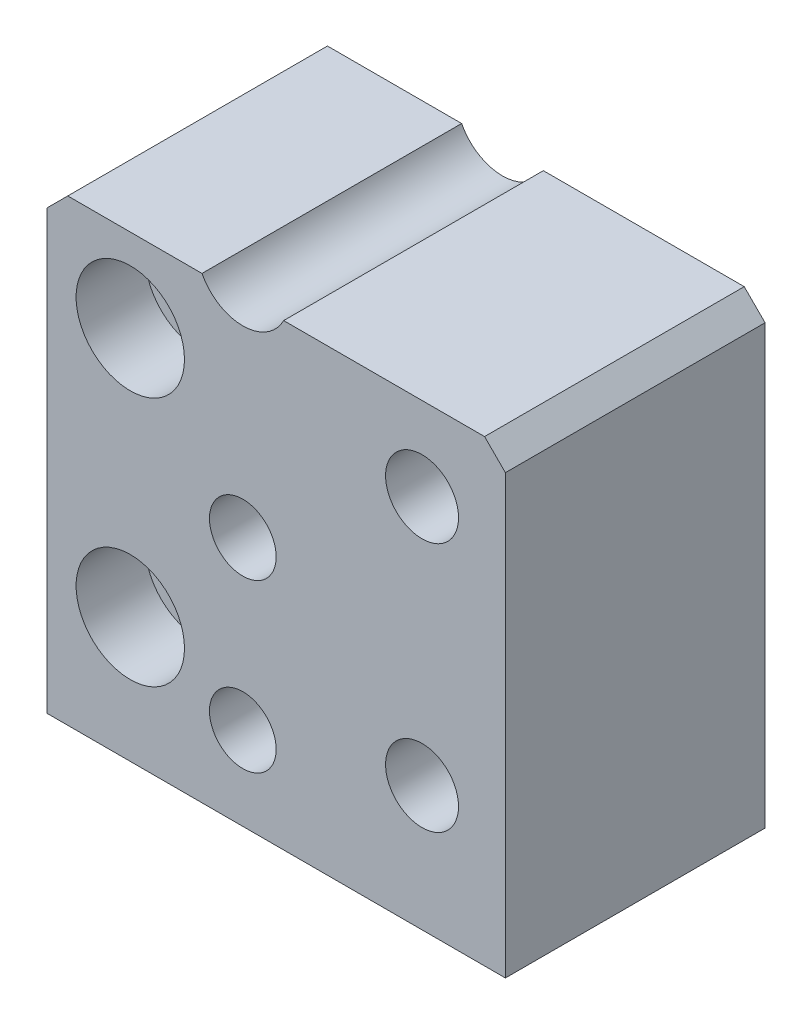
ISO-10303-21;
HEADER;
FILE_DESCRIPTION(('STEP AP214'),'2;1');
FILE_NAME('part.step','',(''),(''),'','','');
FILE_SCHEMA(('AUTOMOTIVE_DESIGN { 1 0 10303 214 1 1 1 1 }'));
ENDSEC;
DATA;
#1=APPLICATION_CONTEXT('core data for automotive mechanical design processes');
#2=APPLICATION_PROTOCOL_DEFINITION('international standard','automotive_design',2000,#1);
#3=PRODUCT_CONTEXT('',#1,'mechanical');
#4=PRODUCT('Part','Part','',(#3));
#5=PRODUCT_RELATED_PRODUCT_CATEGORY('part','',(#4));
#6=PRODUCT_DEFINITION_FORMATION('','',#4);
#7=PRODUCT_DEFINITION_CONTEXT('part definition',#1,'design');
#8=PRODUCT_DEFINITION('design','',#6,#7);
#9=PRODUCT_DEFINITION_SHAPE('','',#8);
#10=(LENGTH_UNIT() NAMED_UNIT(*) SI_UNIT(.MILLI.,.METRE.));
#11=(NAMED_UNIT(*) PLANE_ANGLE_UNIT() SI_UNIT($,.RADIAN.));
#12=(NAMED_UNIT(*) SI_UNIT($,.STERADIAN.) SOLID_ANGLE_UNIT());
#13=UNCERTAINTY_MEASURE_WITH_UNIT(LENGTH_MEASURE(1.E-05),#10,'distance_accuracy_value','');
#14=(GEOMETRIC_REPRESENTATION_CONTEXT(3) GLOBAL_UNCERTAINTY_ASSIGNED_CONTEXT((#13)) GLOBAL_UNIT_ASSIGNED_CONTEXT((#10,
#11,#12)) REPRESENTATION_CONTEXT('',''));
#15=CARTESIAN_POINT('',(0.,0.,0.));
#16=DIRECTION('',(0.,0.,1.));
#17=DIRECTION('',(1.,0.,0.));
#18=AXIS2_PLACEMENT_3D('',#15,#16,#17);
#19=CARTESIAN_POINT('',(0.,110.,0.));
#20=DIRECTION('',(0.,1.,0.));
#21=DIRECTION('',(0.,0.,1.));
#22=AXIS2_PLACEMENT_3D('',#19,#20,#21);
#23=PLANE('',#22);
#24=DIRECTION('',(1.,0.,0.));
#25=VECTOR('',#24,1.);
#26=CARTESIAN_POINT('',(-55.,110.,31.15));
#27=LINE('',#26,#25);
#28=CARTESIAN_POINT('',(1.79795897113267,110.,31.15));
#29=VERTEX_POINT('',#28);
#30=CARTESIAN_POINT('',(50.,110.,31.15));
#31=VERTEX_POINT('',#30);
#32=EDGE_CURVE('E387',#29,#31,#27,.T.);
#33=ORIENTED_EDGE('',*,*,#32,.T.);
#34=DIRECTION('',(0.,0.,-1.));
#35=VECTOR('',#34,1.);
#36=CARTESIAN_POINT('',(50.,110.,-31.15));
#37=LINE('',#36,#35);
#38=CARTESIAN_POINT('',(50.,110.,-31.15));
#39=VERTEX_POINT('',#38);
#40=EDGE_CURVE('E315',#31,#39,#37,.T.);
#41=ORIENTED_EDGE('',*,*,#40,.T.);
#42=DIRECTION('',(-1.,0.,0.));
#43=VECTOR('',#42,1.);
#44=CARTESIAN_POINT('',(-55.,110.,-31.15));
#45=LINE('',#44,#43);
#46=CARTESIAN_POINT('',(1.79795897113267,110.,-31.15));
#47=VERTEX_POINT('',#46);
#48=EDGE_CURVE('E388',#39,#47,#45,.T.);
#49=ORIENTED_EDGE('',*,*,#48,.T.);
#50=DIRECTION('',(0.,0.,-1.));
#51=VECTOR('',#50,1.);
#52=CARTESIAN_POINT('',(1.79795897113267,110.,-31.15));
#53=LINE('',#52,#51);
#54=EDGE_CURVE('E375',#29,#47,#53,.T.);
#55=ORIENTED_EDGE('',*,*,#54,.F.);
#56=EDGE_LOOP('',(#33,#41,#49,#55));
#57=FACE_BOUND('',#56,.T.);
#58=ADVANCED_FACE('F307',(#57),#23,.T.);
#59=CARTESIAN_POINT('',(55.,110.,-31.15));
#60=DIRECTION('',(-1.,0.,0.));
#61=DIRECTION('',(0.,0.,1.));
#62=AXIS2_PLACEMENT_3D('',#59,#60,#61);
#63=PLANE('',#62);
#64=DIRECTION('',(0.,-1.,0.));
#65=VECTOR('',#64,1.);
#66=CARTESIAN_POINT('',(55.,110.,-31.15));
#67=LINE('',#66,#65);
#68=CARTESIAN_POINT('',(55.,105.,-31.15));
#69=VERTEX_POINT('',#68);
#70=CARTESIAN_POINT('',(55.,0.,-31.15));
#71=VERTEX_POINT('',#70);
#72=EDGE_CURVE('E420',#69,#71,#67,.T.);
#73=ORIENTED_EDGE('',*,*,#72,.F.);
#74=DIRECTION('',(0.,0.,1.));
#75=VECTOR('',#74,1.);
#76=CARTESIAN_POINT('',(55.,105.,31.15));
#77=LINE('',#76,#75);
#78=CARTESIAN_POINT('',(55.,105.,31.15));
#79=VERTEX_POINT('',#78);
#80=EDGE_CURVE('E14',#69,#79,#77,.T.);
#81=ORIENTED_EDGE('',*,*,#80,.T.);
#82=DIRECTION('',(0.,-1.,0.));
#83=VECTOR('',#82,1.);
#84=CARTESIAN_POINT('',(55.,110.,31.15));
#85=LINE('',#84,#83);
#86=CARTESIAN_POINT('',(55.,0.,31.15));
#87=VERTEX_POINT('',#86);
#88=EDGE_CURVE('E397',#79,#87,#85,.T.);
#89=ORIENTED_EDGE('',*,*,#88,.T.);
#90=DIRECTION('',(0.,0.,-1.));
#91=VECTOR('',#90,1.);
#92=CARTESIAN_POINT('',(55.,0.,-31.15));
#93=LINE('',#92,#91);
#94=EDGE_CURVE('E402',#87,#71,#93,.T.);
#95=ORIENTED_EDGE('',*,*,#94,.T.);
#96=EDGE_LOOP('',(#73,#81,#89,#95));
#97=FACE_BOUND('',#96,.T.);
#98=ADVANCED_FACE('F508',(#97),#63,.F.);
#99=CARTESIAN_POINT('',(-55.,110.,-31.15));
#100=DIRECTION('',(0.,0.,1.));
#101=DIRECTION('',(1.,0.,0.));
#102=AXIS2_PLACEMENT_3D('',#99,#100,#101);
#103=PLANE('',#102);
#104=CARTESIAN_POINT('',(-35.,90.,-31.15));
#105=DIRECTION('',(0.,0.,-1.));
#106=DIRECTION('',(-1.,0.,0.));
#107=AXIS2_PLACEMENT_3D('',#104,#105,#106);
#108=CIRCLE('',#107,13.);
#109=CARTESIAN_POINT('',(-48.,90.,-31.15));
#110=VERTEX_POINT('',#109);
#111=EDGE_CURVE('E545',#110,#110,#108,.T.);
#112=ORIENTED_EDGE('',*,*,#111,.F.);
#113=EDGE_LOOP('',(#112));
#114=FACE_BOUND('',#113,.T.);
#115=CARTESIAN_POINT('',(-35.,30.,-31.15));
#116=DIRECTION('',(0.,0.,-1.));
#117=DIRECTION('',(-1.,0.,0.));
#118=AXIS2_PLACEMENT_3D('',#115,#116,#117);
#119=CIRCLE('',#118,13.);
#120=CARTESIAN_POINT('',(-48.,30.,-31.15));
#121=VERTEX_POINT('',#120);
#122=EDGE_CURVE('E549',#121,#121,#119,.T.);
#123=ORIENTED_EDGE('',*,*,#122,.F.);
#124=EDGE_LOOP('',(#123));
#125=FACE_BOUND('',#124,.T.);
#126=CARTESIAN_POINT('',(-8.00000000000002,60.,-31.15));
#127=DIRECTION('',(0.,0.,-1.));
#128=DIRECTION('',(-1.,0.,0.));
#129=AXIS2_PLACEMENT_3D('',#126,#127,#128);
#130=CIRCLE('',#129,7.99999999999999);
#131=CARTESIAN_POINT('',(-16.,60.,-31.15));
#132=VERTEX_POINT('',#131);
#133=EDGE_CURVE('E382',#132,#132,#130,.T.);
#134=ORIENTED_EDGE('',*,*,#133,.F.);
#135=EDGE_LOOP('',(#134));
#136=FACE_BOUND('',#135,.T.);
#137=CARTESIAN_POINT('',(-8.00000000000002,20.,-31.15));
#138=DIRECTION('',(0.,0.,-1.));
#139=DIRECTION('',(-1.,0.,0.));
#140=AXIS2_PLACEMENT_3D('',#137,#138,#139);
#141=CIRCLE('',#140,7.99999999999999);
#142=CARTESIAN_POINT('',(-16.,20.,-31.15));
#143=VERTEX_POINT('',#142);
#144=EDGE_CURVE('E448',#143,#143,#141,.T.);
#145=ORIENTED_EDGE('',*,*,#144,.F.);
#146=EDGE_LOOP('',(#145));
#147=FACE_BOUND('',#146,.T.);
#148=CARTESIAN_POINT('',(35.,90.,-31.15));
#149=DIRECTION('',(0.,0.,1.));
#150=DIRECTION('',(1.,0.,0.));
#151=AXIS2_PLACEMENT_3D('',#148,#149,#150);
#152=CIRCLE('',#151,8.74999999999999);
#153=CARTESIAN_POINT('',(43.75,90.,-31.15));
#154=VERTEX_POINT('',#153);
#155=EDGE_CURVE('E475',#154,#154,#152,.T.);
#156=ORIENTED_EDGE('',*,*,#155,.T.);
#157=EDGE_LOOP('',(#156));
#158=FACE_BOUND('',#157,.T.);
#159=CARTESIAN_POINT('',(35.,30.,-31.15));
#160=DIRECTION('',(0.,0.,1.));
#161=DIRECTION('',(1.,0.,0.));
#162=AXIS2_PLACEMENT_3D('',#159,#160,#161);
#163=CIRCLE('',#162,8.74999999999999);
#164=CARTESIAN_POINT('',(43.75,30.,-31.15));
#165=VERTEX_POINT('',#164);
#166=EDGE_CURVE('E406',#165,#165,#163,.T.);
#167=ORIENTED_EDGE('',*,*,#166,.T.);
#168=EDGE_LOOP('',(#167));
#169=FACE_BOUND('',#168,.T.);
#170=DIRECTION('',(0.,-1.,0.));
#171=VECTOR('',#170,1.);
#172=CARTESIAN_POINT('',(-55.,110.,-31.15));
#173=LINE('',#172,#171);
#174=CARTESIAN_POINT('',(-55.,105.,-31.15));
#175=VERTEX_POINT('',#174);
#176=CARTESIAN_POINT('',(-55.,0.,-31.15));
#177=VERTEX_POINT('',#176);
#178=EDGE_CURVE('E418',#175,#177,#173,.T.);
#179=ORIENTED_EDGE('',*,*,#178,.F.);
#180=DIRECTION('',(0.707106781186547,0.707106781186549,0.));
#181=VECTOR('',#180,1.);
#182=CARTESIAN_POINT('',(-50.,110.,-31.15));
#183=LINE('',#182,#181);
#184=CARTESIAN_POINT('',(-50.,110.,-31.15));
#185=VERTEX_POINT('',#184);
#186=EDGE_CURVE('E431',#175,#185,#183,.T.);
#187=ORIENTED_EDGE('',*,*,#186,.T.);
#188=CARTESIAN_POINT('',(-17.7979589711327,110.,-31.15));
#189=VERTEX_POINT('',#188);
#190=EDGE_CURVE('E398',#189,#185,#45,.T.);
#191=ORIENTED_EDGE('',*,*,#190,.F.);
#192=CARTESIAN_POINT('',(-8.00000000000003,115.,-31.15));
#193=DIRECTION('',(0.,0.,-1.));
#194=DIRECTION('',(-1.,0.,0.));
#195=AXIS2_PLACEMENT_3D('',#192,#193,#194);
#196=CIRCLE('',#195,11.);
#197=EDGE_CURVE('E383',#47,#189,#196,.T.);
#198=ORIENTED_EDGE('',*,*,#197,.F.);
#199=ORIENTED_EDGE('',*,*,#48,.F.);
#200=DIRECTION('',(0.707106781186546,-0.707106781186549,0.));
#201=VECTOR('',#200,1.);
#202=CARTESIAN_POINT('',(50.,110.,-31.15));
#203=LINE('',#202,#201);
#204=EDGE_CURVE('E322',#39,#69,#203,.T.);
#205=ORIENTED_EDGE('',*,*,#204,.T.);
#206=ORIENTED_EDGE('',*,*,#72,.T.);
#207=DIRECTION('',(-1.,0.,0.));
#208=VECTOR('',#207,1.);
#209=CARTESIAN_POINT('',(-55.,0.,-31.15));
#210=LINE('',#209,#208);
#211=EDGE_CURVE('E405',#71,#177,#210,.T.);
#212=ORIENTED_EDGE('',*,*,#211,.T.);
#213=EDGE_LOOP('',(#179,#187,#191,#198,#199,#205,#206,#212));
#214=FACE_BOUND('',#213,.T.);
#215=ADVANCED_FACE('F433',(#114,#125,#136,#147,#158,#169,#214),#103,.F.);
#216=CARTESIAN_POINT('',(-55.,110.,-31.15));
#217=DIRECTION('',(1.,0.,0.));
#218=DIRECTION('',(0.,0.,-1.));
#219=AXIS2_PLACEMENT_3D('',#216,#217,#218);
#220=PLANE('',#219);
#221=DIRECTION('',(0.,-1.,0.));
#222=VECTOR('',#221,1.);
#223=CARTESIAN_POINT('',(-55.,110.,31.15));
#224=LINE('',#223,#222);
#225=CARTESIAN_POINT('',(-55.,105.,31.15));
#226=VERTEX_POINT('',#225);
#227=CARTESIAN_POINT('',(-55.,0.,31.15));
#228=VERTEX_POINT('',#227);
#229=EDGE_CURVE('E416',#226,#228,#224,.T.);
#230=ORIENTED_EDGE('',*,*,#229,.F.);
#231=DIRECTION('',(0.,0.,-1.));
#232=VECTOR('',#231,1.);
#233=CARTESIAN_POINT('',(-55.,105.,-31.15));
#234=LINE('',#233,#232);
#235=EDGE_CURVE('E428',#226,#175,#234,.T.);
#236=ORIENTED_EDGE('',*,*,#235,.T.);
#237=ORIENTED_EDGE('',*,*,#178,.T.);
#238=DIRECTION('',(0.,0.,1.));
#239=VECTOR('',#238,1.);
#240=CARTESIAN_POINT('',(-55.,0.,-31.15));
#241=LINE('',#240,#239);
#242=EDGE_CURVE('E409',#177,#228,#241,.T.);
#243=ORIENTED_EDGE('',*,*,#242,.T.);
#244=EDGE_LOOP('',(#230,#236,#237,#243));
#245=FACE_BOUND('',#244,.T.);
#246=ADVANCED_FACE('F494',(#245),#220,.F.);
#247=CARTESIAN_POINT('',(-55.,110.,31.15));
#248=DIRECTION('',(0.,0.,-1.));
#249=DIRECTION('',(-1.,0.,0.));
#250=AXIS2_PLACEMENT_3D('',#247,#248,#249);
#251=PLANE('',#250);
#252=CARTESIAN_POINT('',(-8.00000000000002,60.,31.15));
#253=DIRECTION('',(0.,0.,-1.));
#254=DIRECTION('',(-1.,0.,0.));
#255=AXIS2_PLACEMENT_3D('',#252,#253,#254);
#256=CIRCLE('',#255,7.99999999999999);
#257=CARTESIAN_POINT('',(-16.,60.,31.15));
#258=VERTEX_POINT('',#257);
#259=EDGE_CURVE('E445',#258,#258,#256,.T.);
#260=ORIENTED_EDGE('',*,*,#259,.T.);
#261=EDGE_LOOP('',(#260));
#262=FACE_BOUND('',#261,.T.);
#263=CARTESIAN_POINT('',(-8.00000000000002,20.,31.15));
#264=DIRECTION('',(0.,0.,-1.));
#265=DIRECTION('',(-1.,0.,0.));
#266=AXIS2_PLACEMENT_3D('',#263,#264,#265);
#267=CIRCLE('',#266,7.99999999999999);
#268=CARTESIAN_POINT('',(-16.,20.,31.15));
#269=VERTEX_POINT('',#268);
#270=EDGE_CURVE('E451',#269,#269,#267,.T.);
#271=ORIENTED_EDGE('',*,*,#270,.T.);
#272=EDGE_LOOP('',(#271));
#273=FACE_BOUND('',#272,.T.);
#274=CARTESIAN_POINT('',(-35.,90.,31.15));
#275=DIRECTION('',(0.,0.,1.));
#276=DIRECTION('',(1.,0.,0.));
#277=AXIS2_PLACEMENT_3D('',#274,#275,#276);
#278=CIRCLE('',#277,13.);
#279=CARTESIAN_POINT('',(-22.,90.,31.15));
#280=VERTEX_POINT('',#279);
#281=EDGE_CURVE('E454',#280,#280,#278,.T.);
#282=ORIENTED_EDGE('',*,*,#281,.F.);
#283=EDGE_LOOP('',(#282));
#284=FACE_BOUND('',#283,.T.);
#285=CARTESIAN_POINT('',(-35.,30.,31.15));
#286=DIRECTION('',(0.,0.,1.));
#287=DIRECTION('',(1.,0.,0.));
#288=AXIS2_PLACEMENT_3D('',#285,#286,#287);
#289=CIRCLE('',#288,13.);
#290=CARTESIAN_POINT('',(-22.,30.,31.15));
#291=VERTEX_POINT('',#290);
#292=EDGE_CURVE('E463',#291,#291,#289,.T.);
#293=ORIENTED_EDGE('',*,*,#292,.F.);
#294=EDGE_LOOP('',(#293));
#295=FACE_BOUND('',#294,.T.);
#296=CARTESIAN_POINT('',(35.,90.,31.15));
#297=DIRECTION('',(0.,0.,1.));
#298=DIRECTION('',(1.,0.,0.));
#299=AXIS2_PLACEMENT_3D('',#296,#297,#298);
#300=CIRCLE('',#299,8.74999999999999);
#301=CARTESIAN_POINT('',(43.75,90.,31.15));
#302=VERTEX_POINT('',#301);
#303=EDGE_CURVE('E472',#302,#302,#300,.T.);
#304=ORIENTED_EDGE('',*,*,#303,.F.);
#305=EDGE_LOOP('',(#304));
#306=FACE_BOUND('',#305,.T.);
#307=CARTESIAN_POINT('',(35.,30.,31.15));
#308=DIRECTION('',(0.,0.,1.));
#309=DIRECTION('',(1.,0.,0.));
#310=AXIS2_PLACEMENT_3D('',#307,#308,#309);
#311=CIRCLE('',#310,8.74999999999999);
#312=CARTESIAN_POINT('',(43.75,30.,31.15));
#313=VERTEX_POINT('',#312);
#314=EDGE_CURVE('E478',#313,#313,#311,.T.);
#315=ORIENTED_EDGE('',*,*,#314,.F.);
#316=EDGE_LOOP('',(#315));
#317=FACE_BOUND('',#316,.T.);
#318=CARTESIAN_POINT('',(-50.,110.,31.15));
#319=VERTEX_POINT('',#318);
#320=CARTESIAN_POINT('',(-17.7979589711327,110.,31.15));
#321=VERTEX_POINT('',#320);
#322=EDGE_CURVE('E395',#319,#321,#27,.T.);
#323=ORIENTED_EDGE('',*,*,#322,.F.);
#324=DIRECTION('',(-0.707106781186547,-0.707106781186549,0.));
#325=VECTOR('',#324,1.);
#326=CARTESIAN_POINT('',(-50.,110.,31.15));
#327=LINE('',#326,#325);
#328=EDGE_CURVE('E426',#319,#226,#327,.T.);
#329=ORIENTED_EDGE('',*,*,#328,.T.);
#330=ORIENTED_EDGE('',*,*,#229,.T.);
#331=DIRECTION('',(1.,0.,0.));
#332=VECTOR('',#331,1.);
#333=CARTESIAN_POINT('',(-55.,0.,31.15));
#334=LINE('',#333,#332);
#335=EDGE_CURVE('E412',#228,#87,#334,.T.);
#336=ORIENTED_EDGE('',*,*,#335,.T.);
#337=ORIENTED_EDGE('',*,*,#88,.F.);
#338=DIRECTION('',(-0.707106781186546,0.707106781186549,0.));
#339=VECTOR('',#338,1.);
#340=CARTESIAN_POINT('',(50.,110.,31.15));
#341=LINE('',#340,#339);
#342=EDGE_CURVE('E394',#79,#31,#341,.T.);
#343=ORIENTED_EDGE('',*,*,#342,.T.);
#344=ORIENTED_EDGE('',*,*,#32,.F.);
#345=CARTESIAN_POINT('',(-8.00000000000003,115.,31.15));
#346=DIRECTION('',(0.,0.,-1.));
#347=DIRECTION('',(-1.,0.,0.));
#348=AXIS2_PLACEMENT_3D('',#345,#346,#347);
#349=CIRCLE('',#348,11.);
#350=EDGE_CURVE('E372',#29,#321,#349,.T.);
#351=ORIENTED_EDGE('',*,*,#350,.T.);
#352=EDGE_LOOP('',(#323,#329,#330,#336,#337,#343,#344,#351));
#353=FACE_BOUND('',#352,.T.);
#354=ADVANCED_FACE('F391',(#262,#273,#284,#295,#306,#317,#353),#251,.F.);
#355=ORIENTED_EDGE('',*,*,#190,.T.);
#356=DIRECTION('',(0.,0.,1.));
#357=VECTOR('',#356,1.);
#358=CARTESIAN_POINT('',(-50.,110.,31.15));
#359=LINE('',#358,#357);
#360=EDGE_CURVE('E389',#185,#319,#359,.T.);
#361=ORIENTED_EDGE('',*,*,#360,.T.);
#362=ORIENTED_EDGE('',*,*,#322,.T.);
#363=DIRECTION('',(0.,0.,-1.));
#364=VECTOR('',#363,1.);
#365=CARTESIAN_POINT('',(-17.7979589711327,110.,-31.15));
#366=LINE('',#365,#364);
#367=EDGE_CURVE('E378',#189,#321,#366,.F.);
#368=ORIENTED_EDGE('',*,*,#367,.F.);
#369=EDGE_LOOP('',(#355,#361,#362,#368));
#370=FACE_BOUND('',#369,.T.);
#371=ADVANCED_FACE('F493',(#370),#23,.T.);
#372=CARTESIAN_POINT('',(0.,0.,0.));
#373=DIRECTION('',(0.,1.,0.));
#374=DIRECTION('',(0.,0.,1.));
#375=AXIS2_PLACEMENT_3D('',#372,#373,#374);
#376=PLANE('',#375);
#377=ORIENTED_EDGE('',*,*,#94,.F.);
#378=ORIENTED_EDGE('',*,*,#335,.F.);
#379=ORIENTED_EDGE('',*,*,#242,.F.);
#380=ORIENTED_EDGE('',*,*,#211,.F.);
#381=EDGE_LOOP('',(#377,#378,#379,#380));
#382=FACE_BOUND('',#381,.T.);
#383=ADVANCED_FACE('F488',(#382),#376,.F.);
#384=CARTESIAN_POINT('',(35.,30.,31.15));
#385=DIRECTION('',(0.,0.,1.));
#386=DIRECTION('',(1.,0.,0.));
#387=AXIS2_PLACEMENT_3D('',#384,#385,#386);
#388=CYLINDRICAL_SURFACE('',#387,8.74999999999999);
#389=ORIENTED_EDGE('',*,*,#166,.F.);
#390=EDGE_LOOP('',(#389));
#391=FACE_BOUND('',#390,.T.);
#392=ORIENTED_EDGE('',*,*,#314,.T.);
#393=EDGE_LOOP('',(#392));
#394=FACE_BOUND('',#393,.T.);
#395=ADVANCED_FACE('F484',(#391,#394),#388,.F.);
#396=CARTESIAN_POINT('',(35.,90.,31.15));
#397=DIRECTION('',(0.,0.,1.));
#398=DIRECTION('',(1.,0.,0.));
#399=AXIS2_PLACEMENT_3D('',#396,#397,#398);
#400=CYLINDRICAL_SURFACE('',#399,8.74999999999999);
#401=ORIENTED_EDGE('',*,*,#155,.F.);
#402=EDGE_LOOP('',(#401));
#403=FACE_BOUND('',#402,.T.);
#404=ORIENTED_EDGE('',*,*,#303,.T.);
#405=EDGE_LOOP('',(#404));
#406=FACE_BOUND('',#405,.T.);
#407=ADVANCED_FACE('F487',(#403,#406),#400,.F.);
#408=CARTESIAN_POINT('',(-35.,30.,31.15));
#409=DIRECTION('',(0.,0.,1.));
#410=DIRECTION('',(1.,0.,0.));
#411=AXIS2_PLACEMENT_3D('',#408,#409,#410);
#412=CYLINDRICAL_SURFACE('',#411,8.74999999999999);
#413=CARTESIAN_POINT('',(-35.,30.,-14.55));
#414=DIRECTION('',(0.,0.,-1.));
#415=DIRECTION('',(-1.,0.,0.));
#416=AXIS2_PLACEMENT_3D('',#413,#414,#415);
#417=CIRCLE('',#416,8.75000000000001);
#418=CARTESIAN_POINT('',(-43.75,30.,-14.55));
#419=VERTEX_POINT('',#418);
#420=EDGE_CURVE('E436',#419,#419,#417,.T.);
#421=ORIENTED_EDGE('',*,*,#420,.T.);
#422=EDGE_LOOP('',(#421));
#423=FACE_BOUND('',#422,.T.);
#424=CARTESIAN_POINT('',(-35.,30.,14.55));
#425=DIRECTION('',(0.,0.,1.));
#426=DIRECTION('',(1.,0.,0.));
#427=AXIS2_PLACEMENT_3D('',#424,#425,#426);
#428=CIRCLE('',#427,8.75);
#429=CARTESIAN_POINT('',(-26.25,30.,14.55));
#430=VERTEX_POINT('',#429);
#431=EDGE_CURVE('E469',#430,#430,#428,.T.);
#432=ORIENTED_EDGE('',*,*,#431,.T.);
#433=EDGE_LOOP('',(#432));
#434=FACE_BOUND('',#433,.T.);
#435=ADVANCED_FACE('F558',(#423,#434),#412,.F.);
#436=CARTESIAN_POINT('',(-26.25,30.,14.55));
#437=DIRECTION('',(0.,0.,-1.));
#438=DIRECTION('',(-1.,0.,0.));
#439=AXIS2_PLACEMENT_3D('',#436,#437,#438);
#440=PLANE('',#439);
#441=ORIENTED_EDGE('',*,*,#431,.F.);
#442=EDGE_LOOP('',(#441));
#443=FACE_BOUND('',#442,.T.);
#444=CARTESIAN_POINT('',(-35.,30.,14.55));
#445=DIRECTION('',(0.,0.,1.));
#446=DIRECTION('',(1.,0.,0.));
#447=AXIS2_PLACEMENT_3D('',#444,#445,#446);
#448=CIRCLE('',#447,13.);
#449=CARTESIAN_POINT('',(-22.,30.,14.55));
#450=VERTEX_POINT('',#449);
#451=EDGE_CURVE('E466',#450,#450,#448,.T.);
#452=ORIENTED_EDGE('',*,*,#451,.T.);
#453=EDGE_LOOP('',(#452));
#454=FACE_BOUND('',#453,.T.);
#455=ADVANCED_FACE('F564',(#443,#454),#440,.F.);
#456=CARTESIAN_POINT('',(-35.,30.,31.15));
#457=DIRECTION('',(0.,0.,1.));
#458=DIRECTION('',(1.,0.,0.));
#459=AXIS2_PLACEMENT_3D('',#456,#457,#458);
#460=CYLINDRICAL_SURFACE('',#459,13.);
#461=ORIENTED_EDGE('',*,*,#451,.F.);
#462=EDGE_LOOP('',(#461));
#463=FACE_BOUND('',#462,.T.);
#464=ORIENTED_EDGE('',*,*,#292,.T.);
#465=EDGE_LOOP('',(#464));
#466=FACE_BOUND('',#465,.T.);
#467=ADVANCED_FACE('F570',(#463,#466),#460,.F.);
#468=CARTESIAN_POINT('',(-35.,90.,31.15));
#469=DIRECTION('',(0.,0.,1.));
#470=DIRECTION('',(1.,0.,0.));
#471=AXIS2_PLACEMENT_3D('',#468,#469,#470);
#472=CYLINDRICAL_SURFACE('',#471,8.74999999999999);
#473=CARTESIAN_POINT('',(-35.,90.,-14.55));
#474=DIRECTION('',(0.,0.,-1.));
#475=DIRECTION('',(-1.,0.,0.));
#476=AXIS2_PLACEMENT_3D('',#473,#474,#475);
#477=CIRCLE('',#476,8.75000000000001);
#478=CARTESIAN_POINT('',(-43.75,90.,-14.55));
#479=VERTEX_POINT('',#478);
#480=EDGE_CURVE('E615',#479,#479,#477,.T.);
#481=ORIENTED_EDGE('',*,*,#480,.T.);
#482=EDGE_LOOP('',(#481));
#483=FACE_BOUND('',#482,.T.);
#484=CARTESIAN_POINT('',(-35.,90.,14.55));
#485=DIRECTION('',(0.,0.,1.));
#486=DIRECTION('',(1.,0.,0.));
#487=AXIS2_PLACEMENT_3D('',#484,#485,#486);
#488=CIRCLE('',#487,8.75);
#489=CARTESIAN_POINT('',(-26.25,90.,14.55));
#490=VERTEX_POINT('',#489);
#491=EDGE_CURVE('E460',#490,#490,#488,.T.);
#492=ORIENTED_EDGE('',*,*,#491,.T.);
#493=EDGE_LOOP('',(#492));
#494=FACE_BOUND('',#493,.T.);
#495=ADVANCED_FACE('F574',(#483,#494),#472,.F.);
#496=CARTESIAN_POINT('',(-26.25,90.,14.55));
#497=DIRECTION('',(0.,0.,-1.));
#498=DIRECTION('',(-1.,0.,0.));
#499=AXIS2_PLACEMENT_3D('',#496,#497,#498);
#500=PLANE('',#499);
#501=ORIENTED_EDGE('',*,*,#491,.F.);
#502=EDGE_LOOP('',(#501));
#503=FACE_BOUND('',#502,.T.);
#504=CARTESIAN_POINT('',(-35.,90.,14.55));
#505=DIRECTION('',(0.,0.,1.));
#506=DIRECTION('',(1.,0.,0.));
#507=AXIS2_PLACEMENT_3D('',#504,#505,#506);
#508=CIRCLE('',#507,13.);
#509=CARTESIAN_POINT('',(-22.,90.,14.55));
#510=VERTEX_POINT('',#509);
#511=EDGE_CURVE('E457',#510,#510,#508,.T.);
#512=ORIENTED_EDGE('',*,*,#511,.T.);
#513=EDGE_LOOP('',(#512));
#514=FACE_BOUND('',#513,.T.);
#515=ADVANCED_FACE('F578',(#503,#514),#500,.F.);
#516=CARTESIAN_POINT('',(-35.,90.,31.15));
#517=DIRECTION('',(0.,0.,1.));
#518=DIRECTION('',(1.,0.,0.));
#519=AXIS2_PLACEMENT_3D('',#516,#517,#518);
#520=CYLINDRICAL_SURFACE('',#519,13.);
#521=ORIENTED_EDGE('',*,*,#511,.F.);
#522=EDGE_LOOP('',(#521));
#523=FACE_BOUND('',#522,.T.);
#524=ORIENTED_EDGE('',*,*,#281,.T.);
#525=EDGE_LOOP('',(#524));
#526=FACE_BOUND('',#525,.T.);
#527=ADVANCED_FACE('F582',(#523,#526),#520,.F.);
#528=CARTESIAN_POINT('',(-8.00000000000002,20.,-31.15));
#529=DIRECTION('',(0.,0.,-1.));
#530=DIRECTION('',(-1.,0.,0.));
#531=AXIS2_PLACEMENT_3D('',#528,#529,#530);
#532=CYLINDRICAL_SURFACE('',#531,7.99999999999999);
#533=ORIENTED_EDGE('',*,*,#270,.F.);
#534=EDGE_LOOP('',(#533));
#535=FACE_BOUND('',#534,.T.);
#536=ORIENTED_EDGE('',*,*,#144,.T.);
#537=EDGE_LOOP('',(#536));
#538=FACE_BOUND('',#537,.T.);
#539=ADVANCED_FACE('F586',(#535,#538),#532,.F.);
#540=CARTESIAN_POINT('',(-8.00000000000002,60.,-31.15));
#541=DIRECTION('',(0.,0.,-1.));
#542=DIRECTION('',(-1.,0.,0.));
#543=AXIS2_PLACEMENT_3D('',#540,#541,#542);
#544=CYLINDRICAL_SURFACE('',#543,7.99999999999999);
#545=ORIENTED_EDGE('',*,*,#259,.F.);
#546=EDGE_LOOP('',(#545));
#547=FACE_BOUND('',#546,.T.);
#548=ORIENTED_EDGE('',*,*,#133,.T.);
#549=EDGE_LOOP('',(#548));
#550=FACE_BOUND('',#549,.T.);
#551=ADVANCED_FACE('F535',(#547,#550),#544,.F.);
#552=CARTESIAN_POINT('',(-8.00000000000003,115.,-31.15));
#553=DIRECTION('',(0.,0.,-1.));
#554=DIRECTION('',(-1.,0.,0.));
#555=AXIS2_PLACEMENT_3D('',#552,#553,#554);
#556=CYLINDRICAL_SURFACE('',#555,11.);
#557=ORIENTED_EDGE('',*,*,#54,.T.);
#558=ORIENTED_EDGE('',*,*,#197,.T.);
#559=ORIENTED_EDGE('',*,*,#367,.T.);
#560=ORIENTED_EDGE('',*,*,#350,.F.);
#561=EDGE_LOOP('',(#557,#558,#559,#560));
#562=FACE_BOUND('',#561,.T.);
#563=ADVANCED_FACE('F374',(#562),#556,.F.);
#564=CARTESIAN_POINT('',(-50.,110.,0.));
#565=DIRECTION('',(-0.707106781186548,0.707106781186546,0.));
#566=DIRECTION('',(0.,0.,-1.));
#567=AXIS2_PLACEMENT_3D('',#564,#565,#566);
#568=PLANE('',#567);
#569=ORIENTED_EDGE('',*,*,#186,.F.);
#570=ORIENTED_EDGE('',*,*,#235,.F.);
#571=ORIENTED_EDGE('',*,*,#328,.F.);
#572=ORIENTED_EDGE('',*,*,#360,.F.);
#573=EDGE_LOOP('',(#569,#570,#571,#572));
#574=FACE_BOUND('',#573,.T.);
#575=ADVANCED_FACE('F528',(#574),#568,.T.);
#576=CARTESIAN_POINT('',(50.,110.,0.));
#577=DIRECTION('',(0.707106781186549,0.707106781186546,0.));
#578=DIRECTION('',(0.,0.,1.));
#579=AXIS2_PLACEMENT_3D('',#576,#577,#578);
#580=PLANE('',#579);
#581=ORIENTED_EDGE('',*,*,#342,.F.);
#582=ORIENTED_EDGE('',*,*,#80,.F.);
#583=ORIENTED_EDGE('',*,*,#204,.F.);
#584=ORIENTED_EDGE('',*,*,#40,.F.);
#585=EDGE_LOOP('',(#581,#582,#583,#584));
#586=FACE_BOUND('',#585,.T.);
#587=ADVANCED_FACE('F309',(#586),#580,.T.);
#588=CARTESIAN_POINT('',(-26.25,30.,-14.55));
#589=DIRECTION('',(0.,0.,1.));
#590=DIRECTION('',(1.,0.,0.));
#591=AXIS2_PLACEMENT_3D('',#588,#589,#590);
#592=PLANE('',#591);
#593=ORIENTED_EDGE('',*,*,#420,.F.);
#594=EDGE_LOOP('',(#593));
#595=FACE_BOUND('',#594,.T.);
#596=CARTESIAN_POINT('',(-35.,30.,-14.55));
#597=DIRECTION('',(0.,0.,-1.));
#598=DIRECTION('',(-1.,0.,0.));
#599=AXIS2_PLACEMENT_3D('',#596,#597,#598);
#600=CIRCLE('',#599,13.);
#601=CARTESIAN_POINT('',(-48.,30.,-14.55));
#602=VERTEX_POINT('',#601);
#603=EDGE_CURVE('E439',#602,#602,#600,.T.);
#604=ORIENTED_EDGE('',*,*,#603,.T.);
#605=EDGE_LOOP('',(#604));
#606=FACE_BOUND('',#605,.T.);
#607=ADVANCED_FACE('F534',(#595,#606),#592,.F.);
#608=CARTESIAN_POINT('',(-35.,30.,-31.15));
#609=DIRECTION('',(0.,0.,-1.));
#610=DIRECTION('',(-1.,0.,0.));
#611=AXIS2_PLACEMENT_3D('',#608,#609,#610);
#612=CYLINDRICAL_SURFACE('',#611,13.);
#613=ORIENTED_EDGE('',*,*,#603,.F.);
#614=EDGE_LOOP('',(#613));
#615=FACE_BOUND('',#614,.T.);
#616=ORIENTED_EDGE('',*,*,#122,.T.);
#617=EDGE_LOOP('',(#616));
#618=FACE_BOUND('',#617,.T.);
#619=ADVANCED_FACE('F596',(#615,#618),#612,.F.);
#620=CARTESIAN_POINT('',(-26.25,90.,-14.55));
#621=DIRECTION('',(0.,0.,1.));
#622=DIRECTION('',(1.,0.,0.));
#623=AXIS2_PLACEMENT_3D('',#620,#621,#622);
#624=PLANE('',#623);
#625=ORIENTED_EDGE('',*,*,#480,.F.);
#626=EDGE_LOOP('',(#625));
#627=FACE_BOUND('',#626,.T.);
#628=CARTESIAN_POINT('',(-35.,90.,-14.55));
#629=DIRECTION('',(0.,0.,-1.));
#630=DIRECTION('',(-1.,0.,0.));
#631=AXIS2_PLACEMENT_3D('',#628,#629,#630);
#632=CIRCLE('',#631,13.);
#633=CARTESIAN_POINT('',(-48.,90.,-14.55));
#634=VERTEX_POINT('',#633);
#635=EDGE_CURVE('E613',#634,#634,#632,.T.);
#636=ORIENTED_EDGE('',*,*,#635,.T.);
#637=EDGE_LOOP('',(#636));
#638=FACE_BOUND('',#637,.T.);
#639=ADVANCED_FACE('F600',(#627,#638),#624,.F.);
#640=CARTESIAN_POINT('',(-35.,90.,-31.15));
#641=DIRECTION('',(0.,0.,-1.));
#642=DIRECTION('',(-1.,0.,0.));
#643=AXIS2_PLACEMENT_3D('',#640,#641,#642);
#644=CYLINDRICAL_SURFACE('',#643,13.);
#645=ORIENTED_EDGE('',*,*,#635,.F.);
#646=EDGE_LOOP('',(#645));
#647=FACE_BOUND('',#646,.T.);
#648=ORIENTED_EDGE('',*,*,#111,.T.);
#649=EDGE_LOOP('',(#648));
#650=FACE_BOUND('',#649,.T.);
#651=ADVANCED_FACE('F604',(#647,#650),#644,.F.);
#652=CLOSED_SHELL('',(#58,#98,#215,#246,#354,#371,#383,#395,#407,#435,#455,#467,#495,#515,#527,
#539,#551,#563,#575,#587,#607,#619,#639,#651));
#653=MANIFOLD_SOLID_BREP('B2',#652);
#654=ADVANCED_BREP_SHAPE_REPRESENTATION('',(#18,#653),#14);
#655=SHAPE_DEFINITION_REPRESENTATION(#9,#654);
ENDSEC;
END-ISO-10303-21;
